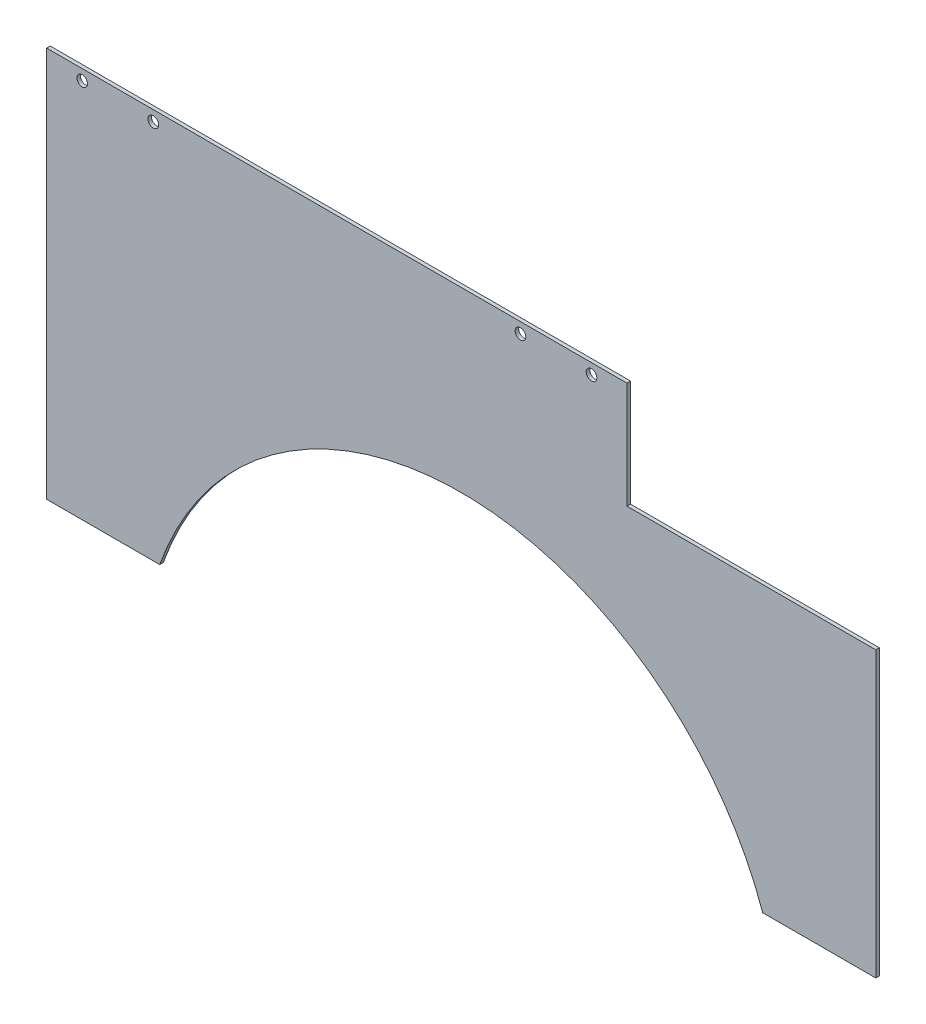
ISO-10303-21;
HEADER;
FILE_DESCRIPTION(('STEP AP214'),'2;1');
FILE_NAME('part.step','',(''),(''),'','','');
FILE_SCHEMA(('AUTOMOTIVE_DESIGN { 1 0 10303 214 1 1 1 1 }'));
ENDSEC;
DATA;
#1=APPLICATION_CONTEXT('core data for automotive mechanical design processes');
#2=APPLICATION_PROTOCOL_DEFINITION('international standard','automotive_design',2000,#1);
#3=PRODUCT_CONTEXT('',#1,'mechanical');
#4=PRODUCT('Part','Part','',(#3));
#5=PRODUCT_RELATED_PRODUCT_CATEGORY('part','',(#4));
#6=PRODUCT_DEFINITION_FORMATION('','',#4);
#7=PRODUCT_DEFINITION_CONTEXT('part definition',#1,'design');
#8=PRODUCT_DEFINITION('design','',#6,#7);
#9=PRODUCT_DEFINITION_SHAPE('','',#8);
#10=(LENGTH_UNIT() NAMED_UNIT(*) SI_UNIT(.MILLI.,.METRE.));
#11=(NAMED_UNIT(*) PLANE_ANGLE_UNIT() SI_UNIT($,.RADIAN.));
#12=(NAMED_UNIT(*) SI_UNIT($,.STERADIAN.) SOLID_ANGLE_UNIT());
#13=UNCERTAINTY_MEASURE_WITH_UNIT(LENGTH_MEASURE(1.E-05),#10,'distance_accuracy_value','');
#14=(GEOMETRIC_REPRESENTATION_CONTEXT(3) GLOBAL_UNCERTAINTY_ASSIGNED_CONTEXT((#13)) GLOBAL_UNIT_ASSIGNED_CONTEXT((#10,
#11,#12)) REPRESENTATION_CONTEXT('',''));
#15=CARTESIAN_POINT('',(0.,0.,0.));
#16=DIRECTION('',(0.,0.,1.));
#17=DIRECTION('',(1.,0.,0.));
#18=AXIS2_PLACEMENT_3D('',#15,#16,#17);
#19=CARTESIAN_POINT('',(0.,0.,1.));
#20=DIRECTION('',(0.,1.,0.));
#21=DIRECTION('',(-1.,0.,0.));
#22=AXIS2_PLACEMENT_3D('',#19,#20,#21);
#23=PLANE('',#22);
#24=DIRECTION('',(1.,0.,0.));
#25=VECTOR('',#24,1.);
#26=CARTESIAN_POINT('',(0.,0.,0.));
#27=LINE('',#26,#25);
#28=CARTESIAN_POINT('',(0.,0.,0.));
#29=VERTEX_POINT('',#28);
#30=CARTESIAN_POINT('',(31.8198051533947,0.,0.));
#31=VERTEX_POINT('',#30);
#32=EDGE_CURVE('E140',#29,#31,#27,.T.);
#33=ORIENTED_EDGE('',*,*,#32,.T.);
#34=DIRECTION('',(0.,0.,1.));
#35=VECTOR('',#34,1.);
#36=CARTESIAN_POINT('',(31.8198051533947,0.,0.));
#37=LINE('',#36,#35);
#38=CARTESIAN_POINT('',(31.8198051533947,0.,1.));
#39=VERTEX_POINT('',#38);
#40=EDGE_CURVE('E11',#31,#39,#37,.T.);
#41=ORIENTED_EDGE('',*,*,#40,.T.);
#42=DIRECTION('',(1.,0.,0.));
#43=VECTOR('',#42,1.);
#44=CARTESIAN_POINT('',(0.,0.,1.));
#45=LINE('',#44,#43);
#46=CARTESIAN_POINT('',(0.,0.,1.));
#47=VERTEX_POINT('',#46);
#48=EDGE_CURVE('E118',#47,#39,#45,.T.);
#49=ORIENTED_EDGE('',*,*,#48,.F.);
#50=DIRECTION('',(0.,0.,-1.));
#51=VECTOR('',#50,1.);
#52=CARTESIAN_POINT('',(0.,0.,1.));
#53=LINE('',#52,#51);
#54=EDGE_CURVE('E109',#47,#29,#53,.T.);
#55=ORIENTED_EDGE('',*,*,#54,.T.);
#56=EDGE_LOOP('',(#33,#41,#49,#55));
#57=FACE_BOUND('',#56,.T.);
#58=ADVANCED_FACE('F41',(#57),#23,.F.);
#59=CARTESIAN_POINT('',(0.,0.,1.));
#60=DIRECTION('',(0.,0.,-1.));
#61=DIRECTION('',(-1.,0.,0.));
#62=AXIS2_PLACEMENT_3D('',#59,#60,#61);
#63=PLANE('',#62);
#64=CARTESIAN_POINT('',(133.345237791561,107.,1.));
#65=DIRECTION('',(0.,0.,1.));
#66=DIRECTION('',(-1.,0.,0.));
#67=AXIS2_PLACEMENT_3D('',#64,#65,#66);
#68=CIRCLE('',#67,1.5);
#69=CARTESIAN_POINT('',(131.845237791561,107.,1.));
#70=VERTEX_POINT('',#69);
#71=EDGE_CURVE('E168',#70,#70,#68,.T.);
#72=ORIENTED_EDGE('',*,*,#71,.F.);
#73=EDGE_LOOP('',(#72));
#74=FACE_BOUND('',#73,.T.);
#75=CARTESIAN_POINT('',(153.345237791561,107.,1.));
#76=DIRECTION('',(0.,0.,1.));
#77=DIRECTION('',(-1.,0.,0.));
#78=AXIS2_PLACEMENT_3D('',#75,#76,#77);
#79=CIRCLE('',#78,1.49999999999997);
#80=CARTESIAN_POINT('',(151.845237791561,107.,1.));
#81=VERTEX_POINT('',#80);
#82=EDGE_CURVE('E165',#81,#81,#79,.T.);
#83=ORIENTED_EDGE('',*,*,#82,.F.);
#84=EDGE_LOOP('',(#83));
#85=FACE_BOUND('',#84,.T.);
#86=ORIENTED_EDGE('',*,*,#48,.T.);
#87=CARTESIAN_POINT('',(116.67261889578,-30.,1.));
#88=DIRECTION('',(0.,0.,1.));
#89=DIRECTION('',(1.,0.,0.));
#90=AXIS2_PLACEMENT_3D('',#87,#88,#89);
#91=CIRCLE('',#90,90.);
#92=CARTESIAN_POINT('',(201.525432638166,0.,1.));
#93=VERTEX_POINT('',#92);
#94=EDGE_CURVE('E105',#93,#39,#91,.T.);
#95=ORIENTED_EDGE('',*,*,#94,.F.);
#96=CARTESIAN_POINT('',(233.345237791561,0.,1.));
#97=VERTEX_POINT('',#96);
#98=EDGE_CURVE('E115',#93,#97,#45,.T.);
#99=ORIENTED_EDGE('',*,*,#98,.T.);
#100=DIRECTION('',(0.,1.,0.));
#101=VECTOR('',#100,1.);
#102=CARTESIAN_POINT('',(233.345237791561,0.,1.));
#103=LINE('',#102,#101);
#104=CARTESIAN_POINT('',(233.345237791561,80.,1.));
#105=VERTEX_POINT('',#104);
#106=EDGE_CURVE('E126',#97,#105,#103,.T.);
#107=ORIENTED_EDGE('',*,*,#106,.T.);
#108=DIRECTION('',(1.,0.,0.));
#109=VECTOR('',#108,1.);
#110=CARTESIAN_POINT('',(163.345237791561,80.,1.));
#111=LINE('',#110,#109);
#112=CARTESIAN_POINT('',(163.345237791561,80.,1.));
#113=VERTEX_POINT('',#112);
#114=EDGE_CURVE('E179',#113,#105,#111,.T.);
#115=ORIENTED_EDGE('',*,*,#114,.F.);
#116=DIRECTION('',(0.,-1.,0.));
#117=VECTOR('',#116,1.);
#118=CARTESIAN_POINT('',(163.345237791561,110.,1.));
#119=LINE('',#118,#117);
#120=CARTESIAN_POINT('',(163.345237791561,110.,1.));
#121=VERTEX_POINT('',#120);
#122=EDGE_CURVE('E171',#121,#113,#119,.T.);
#123=ORIENTED_EDGE('',*,*,#122,.F.);
#124=DIRECTION('',(-1.,0.,0.));
#125=VECTOR('',#124,1.);
#126=CARTESIAN_POINT('',(0.,110.,1.));
#127=LINE('',#126,#125);
#128=CARTESIAN_POINT('',(0.,110.,1.));
#129=VERTEX_POINT('',#128);
#130=EDGE_CURVE('E132',#121,#129,#127,.T.);
#131=ORIENTED_EDGE('',*,*,#130,.T.);
#132=DIRECTION('',(0.,-1.,0.));
#133=VECTOR('',#132,1.);
#134=CARTESIAN_POINT('',(0.,0.,1.));
#135=LINE('',#134,#133);
#136=EDGE_CURVE('E124',#129,#47,#135,.T.);
#137=ORIENTED_EDGE('',*,*,#136,.T.);
#138=EDGE_LOOP('',(#86,#95,#99,#107,#115,#123,#131,#137));
#139=FACE_BOUND('',#138,.T.);
#140=CARTESIAN_POINT('',(9.99999999999999,107.,1.));
#141=DIRECTION('',(0.,0.,1.));
#142=DIRECTION('',(1.,0.,0.));
#143=AXIS2_PLACEMENT_3D('',#140,#141,#142);
#144=CIRCLE('',#143,1.5);
#145=CARTESIAN_POINT('',(11.5,107.,1.));
#146=VERTEX_POINT('',#145);
#147=EDGE_CURVE('E139',#146,#146,#144,.T.);
#148=ORIENTED_EDGE('',*,*,#147,.F.);
#149=EDGE_LOOP('',(#148));
#150=FACE_BOUND('',#149,.T.);
#151=CARTESIAN_POINT('',(30.,107.,1.));
#152=DIRECTION('',(0.,0.,1.));
#153=DIRECTION('',(1.,0.,0.));
#154=AXIS2_PLACEMENT_3D('',#151,#152,#153);
#155=CIRCLE('',#154,1.50000000000001);
#156=CARTESIAN_POINT('',(31.5,107.,1.));
#157=VERTEX_POINT('',#156);
#158=EDGE_CURVE('E193',#157,#157,#155,.T.);
#159=ORIENTED_EDGE('',*,*,#158,.F.);
#160=EDGE_LOOP('',(#159));
#161=FACE_BOUND('',#160,.T.);
#162=ADVANCED_FACE('F112',(#74,#85,#139,#150,#161),#63,.F.);
#163=CARTESIAN_POINT('',(0.,0.,0.));
#164=DIRECTION('',(0.,0.,-1.));
#165=DIRECTION('',(-1.,0.,0.));
#166=AXIS2_PLACEMENT_3D('',#163,#164,#165);
#167=PLANE('',#166);
#168=CARTESIAN_POINT('',(116.67261889578,-30.,0.));
#169=DIRECTION('',(0.,0.,1.));
#170=DIRECTION('',(1.,0.,0.));
#171=AXIS2_PLACEMENT_3D('',#168,#169,#170);
#172=CIRCLE('',#171,90.);
#173=CARTESIAN_POINT('',(201.525432638166,0.,0.));
#174=VERTEX_POINT('',#173);
#175=EDGE_CURVE('E56',#174,#31,#172,.T.);
#176=ORIENTED_EDGE('',*,*,#175,.T.);
#177=ORIENTED_EDGE('',*,*,#32,.F.);
#178=DIRECTION('',(0.,-1.,0.));
#179=VECTOR('',#178,1.);
#180=CARTESIAN_POINT('',(0.,0.,0.));
#181=LINE('',#180,#179);
#182=CARTESIAN_POINT('',(0.,110.,0.));
#183=VERTEX_POINT('',#182);
#184=EDGE_CURVE('E135',#183,#29,#181,.T.);
#185=ORIENTED_EDGE('',*,*,#184,.F.);
#186=DIRECTION('',(-1.,0.,0.));
#187=VECTOR('',#186,1.);
#188=CARTESIAN_POINT('',(0.,110.,0.));
#189=LINE('',#188,#187);
#190=CARTESIAN_POINT('',(163.345237791561,110.,0.));
#191=VERTEX_POINT('',#190);
#192=EDGE_CURVE('E127',#191,#183,#189,.T.);
#193=ORIENTED_EDGE('',*,*,#192,.F.);
#194=DIRECTION('',(0.,-1.,0.));
#195=VECTOR('',#194,1.);
#196=CARTESIAN_POINT('',(163.345237791561,110.,0.));
#197=LINE('',#196,#195);
#198=CARTESIAN_POINT('',(163.345237791561,80.,0.));
#199=VERTEX_POINT('',#198);
#200=EDGE_CURVE('E64',#191,#199,#197,.T.);
#201=ORIENTED_EDGE('',*,*,#200,.T.);
#202=DIRECTION('',(1.,0.,0.));
#203=VECTOR('',#202,1.);
#204=CARTESIAN_POINT('',(163.345237791561,80.,0.));
#205=LINE('',#204,#203);
#206=CARTESIAN_POINT('',(233.345237791561,80.,0.));
#207=VERTEX_POINT('',#206);
#208=EDGE_CURVE('E178',#199,#207,#205,.T.);
#209=ORIENTED_EDGE('',*,*,#208,.T.);
#210=DIRECTION('',(0.,1.,0.));
#211=VECTOR('',#210,1.);
#212=CARTESIAN_POINT('',(233.345237791561,0.,0.));
#213=LINE('',#212,#211);
#214=CARTESIAN_POINT('',(233.345237791561,0.,0.));
#215=VERTEX_POINT('',#214);
#216=EDGE_CURVE('E143',#215,#207,#213,.T.);
#217=ORIENTED_EDGE('',*,*,#216,.F.);
#218=EDGE_CURVE('E138',#174,#215,#27,.T.);
#219=ORIENTED_EDGE('',*,*,#218,.F.);
#220=EDGE_LOOP('',(#176,#177,#185,#193,#201,#209,#217,#219));
#221=FACE_BOUND('',#220,.T.);
#222=CARTESIAN_POINT('',(133.345237791561,107.,0.));
#223=DIRECTION('',(0.,0.,1.));
#224=DIRECTION('',(-1.,0.,0.));
#225=AXIS2_PLACEMENT_3D('',#222,#223,#224);
#226=CIRCLE('',#225,1.5);
#227=CARTESIAN_POINT('',(131.845237791561,107.,0.));
#228=VERTEX_POINT('',#227);
#229=EDGE_CURVE('E172',#228,#228,#226,.T.);
#230=ORIENTED_EDGE('',*,*,#229,.T.);
#231=EDGE_LOOP('',(#230));
#232=FACE_BOUND('',#231,.T.);
#233=CARTESIAN_POINT('',(153.345237791561,107.,0.));
#234=DIRECTION('',(0.,0.,1.));
#235=DIRECTION('',(-1.,0.,0.));
#236=AXIS2_PLACEMENT_3D('',#233,#234,#235);
#237=CIRCLE('',#236,1.49999999999997);
#238=CARTESIAN_POINT('',(151.845237791561,107.,0.));
#239=VERTEX_POINT('',#238);
#240=EDGE_CURVE('E162',#239,#239,#237,.T.);
#241=ORIENTED_EDGE('',*,*,#240,.T.);
#242=EDGE_LOOP('',(#241));
#243=FACE_BOUND('',#242,.T.);
#244=CARTESIAN_POINT('',(9.99999999999999,107.,0.));
#245=DIRECTION('',(0.,0.,1.));
#246=DIRECTION('',(1.,0.,0.));
#247=AXIS2_PLACEMENT_3D('',#244,#245,#246);
#248=CIRCLE('',#247,1.5);
#249=CARTESIAN_POINT('',(11.5,107.,0.));
#250=VERTEX_POINT('',#249);
#251=EDGE_CURVE('E196',#250,#250,#248,.T.);
#252=ORIENTED_EDGE('',*,*,#251,.T.);
#253=EDGE_LOOP('',(#252));
#254=FACE_BOUND('',#253,.T.);
#255=CARTESIAN_POINT('',(30.,107.,0.));
#256=DIRECTION('',(0.,0.,1.));
#257=DIRECTION('',(1.,0.,0.));
#258=AXIS2_PLACEMENT_3D('',#255,#256,#257);
#259=CIRCLE('',#258,1.50000000000001);
#260=CARTESIAN_POINT('',(31.5,107.,0.));
#261=VERTEX_POINT('',#260);
#262=EDGE_CURVE('E188',#261,#261,#259,.T.);
#263=ORIENTED_EDGE('',*,*,#262,.T.);
#264=EDGE_LOOP('',(#263));
#265=FACE_BOUND('',#264,.T.);
#266=ADVANCED_FACE('F159',(#221,#232,#243,#254,#265),#167,.T.);
#267=CARTESIAN_POINT('',(0.,0.,1.));
#268=DIRECTION('',(1.,0.,0.));
#269=DIRECTION('',(0.,0.,-1.));
#270=AXIS2_PLACEMENT_3D('',#267,#268,#269);
#271=PLANE('',#270);
#272=ORIENTED_EDGE('',*,*,#184,.T.);
#273=ORIENTED_EDGE('',*,*,#54,.F.);
#274=ORIENTED_EDGE('',*,*,#136,.F.);
#275=DIRECTION('',(0.,0.,-1.));
#276=VECTOR('',#275,1.);
#277=CARTESIAN_POINT('',(0.,110.,1.));
#278=LINE('',#277,#276);
#279=EDGE_CURVE('E134',#129,#183,#278,.T.);
#280=ORIENTED_EDGE('',*,*,#279,.T.);
#281=EDGE_LOOP('',(#272,#273,#274,#280));
#282=FACE_BOUND('',#281,.T.);
#283=ADVANCED_FACE('F43',(#282),#271,.F.);
#284=ORIENTED_EDGE('',*,*,#98,.F.);
#285=DIRECTION('',(0.,0.,1.));
#286=VECTOR('',#285,1.);
#287=CARTESIAN_POINT('',(201.525432638166,0.,0.));
#288=LINE('',#287,#286);
#289=EDGE_CURVE('E49',#93,#174,#288,.F.);
#290=ORIENTED_EDGE('',*,*,#289,.T.);
#291=ORIENTED_EDGE('',*,*,#218,.T.);
#292=DIRECTION('',(0.,0.,-1.));
#293=VECTOR('',#292,1.);
#294=CARTESIAN_POINT('',(233.345237791561,0.,1.));
#295=LINE('',#294,#293);
#296=EDGE_CURVE('E122',#97,#215,#295,.T.);
#297=ORIENTED_EDGE('',*,*,#296,.F.);
#298=EDGE_LOOP('',(#284,#290,#291,#297));
#299=FACE_BOUND('',#298,.T.);
#300=ADVANCED_FACE('F120',(#299),#23,.F.);
#301=CARTESIAN_POINT('',(233.345237791561,0.,1.));
#302=DIRECTION('',(-1.,0.,0.));
#303=DIRECTION('',(0.,-1.,0.));
#304=AXIS2_PLACEMENT_3D('',#301,#302,#303);
#305=PLANE('',#304);
#306=ORIENTED_EDGE('',*,*,#216,.T.);
#307=DIRECTION('',(0.,0.,1.));
#308=VECTOR('',#307,1.);
#309=CARTESIAN_POINT('',(233.345237791561,80.,0.));
#310=LINE('',#309,#308);
#311=EDGE_CURVE('E189',#207,#105,#310,.T.);
#312=ORIENTED_EDGE('',*,*,#311,.T.);
#313=ORIENTED_EDGE('',*,*,#106,.F.);
#314=ORIENTED_EDGE('',*,*,#296,.T.);
#315=EDGE_LOOP('',(#306,#312,#313,#314));
#316=FACE_BOUND('',#315,.T.);
#317=ADVANCED_FACE('F219',(#316),#305,.F.);
#318=CARTESIAN_POINT('',(0.,110.,1.));
#319=DIRECTION('',(0.,-1.,0.));
#320=DIRECTION('',(1.,0.,0.));
#321=AXIS2_PLACEMENT_3D('',#318,#319,#320);
#322=PLANE('',#321);
#323=ORIENTED_EDGE('',*,*,#130,.F.);
#324=DIRECTION('',(0.,0.,1.));
#325=VECTOR('',#324,1.);
#326=CARTESIAN_POINT('',(163.345237791561,110.,0.));
#327=LINE('',#326,#325);
#328=EDGE_CURVE('E186',#191,#121,#327,.T.);
#329=ORIENTED_EDGE('',*,*,#328,.F.);
#330=ORIENTED_EDGE('',*,*,#192,.T.);
#331=ORIENTED_EDGE('',*,*,#279,.F.);
#332=EDGE_LOOP('',(#323,#329,#330,#331));
#333=FACE_BOUND('',#332,.T.);
#334=ADVANCED_FACE('F208',(#333),#322,.F.);
#335=CARTESIAN_POINT('',(9.99999999999999,107.,1.));
#336=DIRECTION('',(0.,0.,-1.));
#337=DIRECTION('',(-1.,0.,0.));
#338=AXIS2_PLACEMENT_3D('',#335,#336,#337);
#339=CYLINDRICAL_SURFACE('',#338,1.5);
#340=ORIENTED_EDGE('',*,*,#147,.T.);
#341=EDGE_LOOP('',(#340));
#342=FACE_BOUND('',#341,.T.);
#343=ORIENTED_EDGE('',*,*,#251,.F.);
#344=EDGE_LOOP('',(#343));
#345=FACE_BOUND('',#344,.T.);
#346=ADVANCED_FACE('F205',(#342,#345),#339,.F.);
#347=CARTESIAN_POINT('',(30.,107.,1.));
#348=DIRECTION('',(0.,0.,-1.));
#349=DIRECTION('',(-1.,0.,0.));
#350=AXIS2_PLACEMENT_3D('',#347,#348,#349);
#351=CYLINDRICAL_SURFACE('',#350,1.50000000000001);
#352=ORIENTED_EDGE('',*,*,#158,.T.);
#353=EDGE_LOOP('',(#352));
#354=FACE_BOUND('',#353,.T.);
#355=ORIENTED_EDGE('',*,*,#262,.F.);
#356=EDGE_LOOP('',(#355));
#357=FACE_BOUND('',#356,.T.);
#358=ADVANCED_FACE('F207',(#354,#357),#351,.F.);
#359=CARTESIAN_POINT('',(163.345237791561,110.,0.));
#360=DIRECTION('',(-1.,0.,0.));
#361=DIRECTION('',(0.,-1.,0.));
#362=AXIS2_PLACEMENT_3D('',#359,#360,#361);
#363=PLANE('',#362);
#364=ORIENTED_EDGE('',*,*,#122,.T.);
#365=DIRECTION('',(0.,0.,1.));
#366=VECTOR('',#365,1.);
#367=CARTESIAN_POINT('',(163.345237791561,80.,0.));
#368=LINE('',#367,#366);
#369=EDGE_CURVE('E182',#199,#113,#368,.T.);
#370=ORIENTED_EDGE('',*,*,#369,.F.);
#371=ORIENTED_EDGE('',*,*,#200,.F.);
#372=ORIENTED_EDGE('',*,*,#328,.T.);
#373=EDGE_LOOP('',(#364,#370,#371,#372));
#374=FACE_BOUND('',#373,.T.);
#375=ADVANCED_FACE('F215',(#374),#363,.F.);
#376=CARTESIAN_POINT('',(163.345237791561,80.,0.));
#377=DIRECTION('',(0.,-1.,0.));
#378=DIRECTION('',(0.,0.,-1.));
#379=AXIS2_PLACEMENT_3D('',#376,#377,#378);
#380=PLANE('',#379);
#381=ORIENTED_EDGE('',*,*,#114,.T.);
#382=ORIENTED_EDGE('',*,*,#311,.F.);
#383=ORIENTED_EDGE('',*,*,#208,.F.);
#384=ORIENTED_EDGE('',*,*,#369,.T.);
#385=EDGE_LOOP('',(#381,#382,#383,#384));
#386=FACE_BOUND('',#385,.T.);
#387=ADVANCED_FACE('F284',(#386),#380,.F.);
#388=CARTESIAN_POINT('',(153.345237791561,107.,0.));
#389=DIRECTION('',(0.,0.,1.));
#390=DIRECTION('',(1.,0.,0.));
#391=AXIS2_PLACEMENT_3D('',#388,#389,#390);
#392=CYLINDRICAL_SURFACE('',#391,1.49999999999997);
#393=ORIENTED_EDGE('',*,*,#240,.F.);
#394=EDGE_LOOP('',(#393));
#395=FACE_BOUND('',#394,.T.);
#396=ORIENTED_EDGE('',*,*,#82,.T.);
#397=EDGE_LOOP('',(#396));
#398=FACE_BOUND('',#397,.T.);
#399=ADVANCED_FACE('F292',(#395,#398),#392,.F.);
#400=CARTESIAN_POINT('',(133.345237791561,107.,0.));
#401=DIRECTION('',(0.,0.,1.));
#402=DIRECTION('',(1.,0.,0.));
#403=AXIS2_PLACEMENT_3D('',#400,#401,#402);
#404=CYLINDRICAL_SURFACE('',#403,1.5);
#405=ORIENTED_EDGE('',*,*,#229,.F.);
#406=EDGE_LOOP('',(#405));
#407=FACE_BOUND('',#406,.T.);
#408=ORIENTED_EDGE('',*,*,#71,.T.);
#409=EDGE_LOOP('',(#408));
#410=FACE_BOUND('',#409,.T.);
#411=ADVANCED_FACE('F301',(#407,#410),#404,.F.);
#412=CARTESIAN_POINT('',(116.67261889578,-30.,0.));
#413=DIRECTION('',(0.,0.,1.));
#414=DIRECTION('',(1.,0.,0.));
#415=AXIS2_PLACEMENT_3D('',#412,#413,#414);
#416=CYLINDRICAL_SURFACE('',#415,90.);
#417=ORIENTED_EDGE('',*,*,#175,.F.);
#418=ORIENTED_EDGE('',*,*,#289,.F.);
#419=ORIENTED_EDGE('',*,*,#94,.T.);
#420=ORIENTED_EDGE('',*,*,#40,.F.);
#421=EDGE_LOOP('',(#417,#418,#419,#420));
#422=FACE_BOUND('',#421,.T.);
#423=ADVANCED_FACE('F104',(#422),#416,.F.);
#424=CLOSED_SHELL('',(#58,#162,#266,#283,#300,#317,#334,#346,#358,#375,#387,#399,#411,#423));
#425=MANIFOLD_SOLID_BREP('B2',#424);
#426=ADVANCED_BREP_SHAPE_REPRESENTATION('',(#18,#425),#14);
#427=SHAPE_DEFINITION_REPRESENTATION(#9,#426);
ENDSEC;
END-ISO-10303-21;
